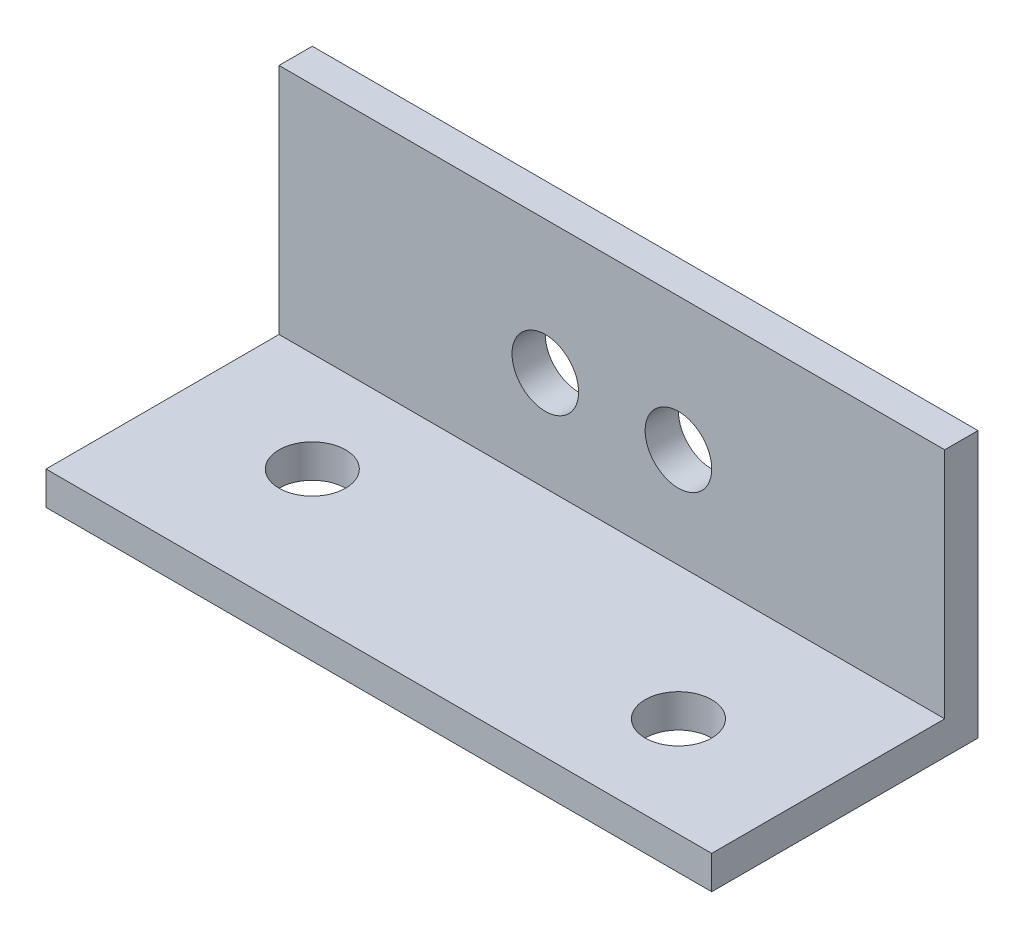
ISO-10303-21;
HEADER;
FILE_DESCRIPTION(('STEP AP214'),'2;1');
FILE_NAME('part.step','',(''),(''),'','','');
FILE_SCHEMA(('AUTOMOTIVE_DESIGN { 1 0 10303 214 1 1 1 1 }'));
ENDSEC;
DATA;
#1=APPLICATION_CONTEXT('core data for automotive mechanical design processes');
#2=APPLICATION_PROTOCOL_DEFINITION('international standard','automotive_design',2000,#1);
#3=PRODUCT_CONTEXT('',#1,'mechanical');
#4=PRODUCT('Part','Part','',(#3));
#5=PRODUCT_RELATED_PRODUCT_CATEGORY('part','',(#4));
#6=PRODUCT_DEFINITION_FORMATION('','',#4);
#7=PRODUCT_DEFINITION_CONTEXT('part definition',#1,'design');
#8=PRODUCT_DEFINITION('design','',#6,#7);
#9=PRODUCT_DEFINITION_SHAPE('','',#8);
#10=(LENGTH_UNIT() NAMED_UNIT(*) SI_UNIT(.MILLI.,.METRE.));
#11=(NAMED_UNIT(*) PLANE_ANGLE_UNIT() SI_UNIT($,.RADIAN.));
#12=(NAMED_UNIT(*) SI_UNIT($,.STERADIAN.) SOLID_ANGLE_UNIT());
#13=UNCERTAINTY_MEASURE_WITH_UNIT(LENGTH_MEASURE(1.E-05),#10,'distance_accuracy_value','');
#14=(GEOMETRIC_REPRESENTATION_CONTEXT(3) GLOBAL_UNCERTAINTY_ASSIGNED_CONTEXT((#13)) GLOBAL_UNIT_ASSIGNED_CONTEXT((#10,
#11,#12)) REPRESENTATION_CONTEXT('',''));
#15=CARTESIAN_POINT('',(0.,0.,0.));
#16=DIRECTION('',(0.,0.,1.));
#17=DIRECTION('',(1.,0.,0.));
#18=AXIS2_PLACEMENT_3D('',#15,#16,#17);
#19=CARTESIAN_POINT('',(0.,3.175,0.));
#20=DIRECTION('',(0.,-1.,0.));
#21=DIRECTION('',(0.,0.,-1.));
#22=AXIS2_PLACEMENT_3D('',#19,#20,#21);
#23=PLANE('',#22);
#24=CARTESIAN_POINT('',(19.05,3.175,3.175));
#25=DIRECTION('',(0.,1.,0.));
#26=DIRECTION('',(0.,0.,1.));
#27=AXIS2_PLACEMENT_3D('',#24,#25,#26);
#28=CIRCLE('',#27,3.175);
#29=CARTESIAN_POINT('',(19.05,3.175,6.35));
#30=VERTEX_POINT('',#29);
#31=EDGE_CURVE('E168',#30,#30,#28,.T.);
#32=ORIENTED_EDGE('',*,*,#31,.F.);
#33=EDGE_LOOP('',(#32));
#34=FACE_BOUND('',#33,.T.);
#35=CARTESIAN_POINT('',(-19.05,3.175,0.));
#36=DIRECTION('',(0.,1.,0.));
#37=DIRECTION('',(0.,0.,1.));
#38=AXIS2_PLACEMENT_3D('',#35,#36,#37);
#39=CIRCLE('',#38,3.175);
#40=CARTESIAN_POINT('',(-19.05,3.175,3.175));
#41=VERTEX_POINT('',#40);
#42=EDGE_CURVE('E162',#41,#41,#39,.T.);
#43=ORIENTED_EDGE('',*,*,#42,.F.);
#44=EDGE_LOOP('',(#43));
#45=FACE_BOUND('',#44,.T.);
#46=DIRECTION('',(1.,0.,0.));
#47=VECTOR('',#46,1.);
#48=CARTESIAN_POINT('',(-31.75,3.175,-9.525));
#49=LINE('',#48,#47);
#50=CARTESIAN_POINT('',(-31.75,3.175,-9.525));
#51=VERTEX_POINT('',#50);
#52=CARTESIAN_POINT('',(31.75,3.175,-9.525));
#53=VERTEX_POINT('',#52);
#54=EDGE_CURVE('E54',#51,#53,#49,.T.);
#55=ORIENTED_EDGE('',*,*,#54,.F.);
#56=DIRECTION('',(0.,0.,1.));
#57=VECTOR('',#56,1.);
#58=CARTESIAN_POINT('',(-31.75,3.175,12.7));
#59=LINE('',#58,#57);
#60=CARTESIAN_POINT('',(-31.75,3.175,12.7));
#61=VERTEX_POINT('',#60);
#62=EDGE_CURVE('E140',#51,#61,#59,.T.);
#63=ORIENTED_EDGE('',*,*,#62,.T.);
#64=DIRECTION('',(1.,0.,0.));
#65=VECTOR('',#64,1.);
#66=CARTESIAN_POINT('',(-31.75,3.175,12.7));
#67=LINE('',#66,#65);
#68=CARTESIAN_POINT('',(31.75,3.175,12.7));
#69=VERTEX_POINT('',#68);
#70=EDGE_CURVE('E60',#61,#69,#67,.T.);
#71=ORIENTED_EDGE('',*,*,#70,.T.);
#72=DIRECTION('',(0.,0.,-1.));
#73=VECTOR('',#72,1.);
#74=CARTESIAN_POINT('',(31.75,3.175,12.7));
#75=LINE('',#74,#73);
#76=EDGE_CURVE('E89',#69,#53,#75,.T.);
#77=ORIENTED_EDGE('',*,*,#76,.T.);
#78=EDGE_LOOP('',(#55,#63,#71,#77));
#79=FACE_BOUND('',#78,.T.);
#80=ADVANCED_FACE('F39',(#34,#45,#79),#23,.F.);
#81=CARTESIAN_POINT('',(31.75,3.175,12.7));
#82=DIRECTION('',(-1.,0.,0.));
#83=DIRECTION('',(0.,0.,1.));
#84=AXIS2_PLACEMENT_3D('',#81,#82,#83);
#85=PLANE('',#84);
#86=DIRECTION('',(0.,0.,-1.));
#87=VECTOR('',#86,1.);
#88=CARTESIAN_POINT('',(31.75,0.,12.7));
#89=LINE('',#88,#87);
#90=CARTESIAN_POINT('',(31.75,0.,12.7));
#91=VERTEX_POINT('',#90);
#92=CARTESIAN_POINT('',(31.75,0.,-12.7));
#93=VERTEX_POINT('',#92);
#94=EDGE_CURVE('E95',#91,#93,#89,.T.);
#95=ORIENTED_EDGE('',*,*,#94,.T.);
#96=DIRECTION('',(0.,-1.,0.));
#97=VECTOR('',#96,1.);
#98=CARTESIAN_POINT('',(31.75,3.175,-12.7));
#99=LINE('',#98,#97);
#100=CARTESIAN_POINT('',(31.75,25.4,-12.7));
#101=VERTEX_POINT('',#100);
#102=EDGE_CURVE('E11',#101,#93,#99,.T.);
#103=ORIENTED_EDGE('',*,*,#102,.F.);
#104=DIRECTION('',(0.,0.,-1.));
#105=VECTOR('',#104,1.);
#106=CARTESIAN_POINT('',(31.75,25.4,-12.7));
#107=LINE('',#106,#105);
#108=CARTESIAN_POINT('',(31.75,25.4,-9.525));
#109=VERTEX_POINT('',#108);
#110=EDGE_CURVE('E131',#109,#101,#107,.T.);
#111=ORIENTED_EDGE('',*,*,#110,.F.);
#112=DIRECTION('',(0.,-1.,0.));
#113=VECTOR('',#112,1.);
#114=CARTESIAN_POINT('',(31.75,25.4,-9.525));
#115=LINE('',#114,#113);
#116=EDGE_CURVE('E104',#109,#53,#115,.T.);
#117=ORIENTED_EDGE('',*,*,#116,.T.);
#118=ORIENTED_EDGE('',*,*,#76,.F.);
#119=DIRECTION('',(0.,-1.,0.));
#120=VECTOR('',#119,1.);
#121=CARTESIAN_POINT('',(31.75,3.175,12.7));
#122=LINE('',#121,#120);
#123=EDGE_CURVE('E82',#69,#91,#122,.T.);
#124=ORIENTED_EDGE('',*,*,#123,.T.);
#125=EDGE_LOOP('',(#95,#103,#111,#117,#118,#124));
#126=FACE_BOUND('',#125,.T.);
#127=ADVANCED_FACE('F41',(#126),#85,.F.);
#128=CARTESIAN_POINT('',(-31.75,3.175,-12.7));
#129=DIRECTION('',(0.,0.,1.));
#130=DIRECTION('',(1.,0.,0.));
#131=AXIS2_PLACEMENT_3D('',#128,#129,#130);
#132=PLANE('',#131);
#133=CARTESIAN_POINT('',(6.34999999999999,12.7,-12.7));
#134=DIRECTION('',(0.,0.,1.));
#135=DIRECTION('',(1.,0.,0.));
#136=AXIS2_PLACEMENT_3D('',#133,#134,#135);
#137=CIRCLE('',#136,3.175);
#138=CARTESIAN_POINT('',(9.525,12.7,-12.7));
#139=VERTEX_POINT('',#138);
#140=EDGE_CURVE('E153',#139,#139,#137,.T.);
#141=ORIENTED_EDGE('',*,*,#140,.T.);
#142=EDGE_LOOP('',(#141));
#143=FACE_BOUND('',#142,.T.);
#144=CARTESIAN_POINT('',(-6.35000000000001,12.7,-12.7));
#145=DIRECTION('',(0.,0.,1.));
#146=DIRECTION('',(1.,0.,0.));
#147=AXIS2_PLACEMENT_3D('',#144,#145,#146);
#148=CIRCLE('',#147,3.175);
#149=CARTESIAN_POINT('',(-3.17500000000001,12.7,-12.7));
#150=VERTEX_POINT('',#149);
#151=EDGE_CURVE('E138',#150,#150,#148,.T.);
#152=ORIENTED_EDGE('',*,*,#151,.T.);
#153=EDGE_LOOP('',(#152));
#154=FACE_BOUND('',#153,.T.);
#155=DIRECTION('',(-1.,0.,0.));
#156=VECTOR('',#155,1.);
#157=CARTESIAN_POINT('',(-31.75,0.,-12.7));
#158=LINE('',#157,#156);
#159=CARTESIAN_POINT('',(-31.75,0.,-12.7));
#160=VERTEX_POINT('',#159);
#161=EDGE_CURVE('E99',#93,#160,#158,.T.);
#162=ORIENTED_EDGE('',*,*,#161,.T.);
#163=DIRECTION('',(0.,-1.,0.));
#164=VECTOR('',#163,1.);
#165=CARTESIAN_POINT('',(-31.75,3.175,-12.7));
#166=LINE('',#165,#164);
#167=CARTESIAN_POINT('',(-31.75,25.4,-12.7));
#168=VERTEX_POINT('',#167);
#169=EDGE_CURVE('E47',#168,#160,#166,.T.);
#170=ORIENTED_EDGE('',*,*,#169,.F.);
#171=DIRECTION('',(-1.,0.,0.));
#172=VECTOR('',#171,1.);
#173=CARTESIAN_POINT('',(-31.75,25.4,-12.7));
#174=LINE('',#173,#172);
#175=EDGE_CURVE('E123',#101,#168,#174,.T.);
#176=ORIENTED_EDGE('',*,*,#175,.F.);
#177=ORIENTED_EDGE('',*,*,#102,.T.);
#178=EDGE_LOOP('',(#162,#170,#176,#177));
#179=FACE_BOUND('',#178,.T.);
#180=ADVANCED_FACE('F121',(#143,#154,#179),#132,.F.);
#181=CARTESIAN_POINT('',(-31.75,3.175,12.7));
#182=DIRECTION('',(1.,0.,0.));
#183=DIRECTION('',(0.,0.,-1.));
#184=AXIS2_PLACEMENT_3D('',#181,#182,#183);
#185=PLANE('',#184);
#186=DIRECTION('',(0.,0.,1.));
#187=VECTOR('',#186,1.);
#188=CARTESIAN_POINT('',(-31.75,0.,12.7));
#189=LINE('',#188,#187);
#190=CARTESIAN_POINT('',(-31.75,0.,12.7));
#191=VERTEX_POINT('',#190);
#192=EDGE_CURVE('E90',#160,#191,#189,.T.);
#193=ORIENTED_EDGE('',*,*,#192,.T.);
#194=DIRECTION('',(0.,-1.,0.));
#195=VECTOR('',#194,1.);
#196=CARTESIAN_POINT('',(-31.75,3.175,12.7));
#197=LINE('',#196,#195);
#198=EDGE_CURVE('E85',#61,#191,#197,.T.);
#199=ORIENTED_EDGE('',*,*,#198,.F.);
#200=ORIENTED_EDGE('',*,*,#62,.F.);
#201=DIRECTION('',(0.,-1.,0.));
#202=VECTOR('',#201,1.);
#203=CARTESIAN_POINT('',(-31.75,25.4,-9.525));
#204=LINE('',#203,#202);
#205=CARTESIAN_POINT('',(-31.75,25.4,-9.525));
#206=VERTEX_POINT('',#205);
#207=EDGE_CURVE('E100',#206,#51,#204,.T.);
#208=ORIENTED_EDGE('',*,*,#207,.F.);
#209=DIRECTION('',(0.,0.,1.));
#210=VECTOR('',#209,1.);
#211=CARTESIAN_POINT('',(-31.75,25.4,-12.7));
#212=LINE('',#211,#210);
#213=EDGE_CURVE('E117',#168,#206,#212,.T.);
#214=ORIENTED_EDGE('',*,*,#213,.F.);
#215=ORIENTED_EDGE('',*,*,#169,.T.);
#216=EDGE_LOOP('',(#193,#199,#200,#208,#214,#215));
#217=FACE_BOUND('',#216,.T.);
#218=ADVANCED_FACE('F114',(#217),#185,.F.);
#219=CARTESIAN_POINT('',(-31.75,3.175,12.7));
#220=DIRECTION('',(0.,0.,-1.));
#221=DIRECTION('',(-1.,0.,0.));
#222=AXIS2_PLACEMENT_3D('',#219,#220,#221);
#223=PLANE('',#222);
#224=DIRECTION('',(1.,0.,0.));
#225=VECTOR('',#224,1.);
#226=CARTESIAN_POINT('',(-31.75,0.,12.7));
#227=LINE('',#226,#225);
#228=EDGE_CURVE('E79',#191,#91,#227,.T.);
#229=ORIENTED_EDGE('',*,*,#228,.T.);
#230=ORIENTED_EDGE('',*,*,#123,.F.);
#231=ORIENTED_EDGE('',*,*,#70,.F.);
#232=ORIENTED_EDGE('',*,*,#198,.T.);
#233=EDGE_LOOP('',(#229,#230,#231,#232));
#234=FACE_BOUND('',#233,.T.);
#235=ADVANCED_FACE('F81',(#234),#223,.F.);
#236=CARTESIAN_POINT('',(0.,0.,0.));
#237=DIRECTION('',(0.,-1.,0.));
#238=DIRECTION('',(0.,0.,-1.));
#239=AXIS2_PLACEMENT_3D('',#236,#237,#238);
#240=PLANE('',#239);
#241=CARTESIAN_POINT('',(19.05,0.,3.175));
#242=DIRECTION('',(0.,1.,0.));
#243=DIRECTION('',(0.,0.,1.));
#244=AXIS2_PLACEMENT_3D('',#241,#242,#243);
#245=CIRCLE('',#244,3.175);
#246=CARTESIAN_POINT('',(19.05,0.,6.35));
#247=VERTEX_POINT('',#246);
#248=EDGE_CURVE('E165',#247,#247,#245,.T.);
#249=ORIENTED_EDGE('',*,*,#248,.T.);
#250=EDGE_LOOP('',(#249));
#251=FACE_BOUND('',#250,.T.);
#252=CARTESIAN_POINT('',(-19.05,0.,0.));
#253=DIRECTION('',(0.,1.,0.));
#254=DIRECTION('',(0.,0.,1.));
#255=AXIS2_PLACEMENT_3D('',#252,#253,#254);
#256=CIRCLE('',#255,3.175);
#257=CARTESIAN_POINT('',(-19.05,0.,3.175));
#258=VERTEX_POINT('',#257);
#259=EDGE_CURVE('E159',#258,#258,#256,.T.);
#260=ORIENTED_EDGE('',*,*,#259,.T.);
#261=EDGE_LOOP('',(#260));
#262=FACE_BOUND('',#261,.T.);
#263=ORIENTED_EDGE('',*,*,#94,.F.);
#264=ORIENTED_EDGE('',*,*,#228,.F.);
#265=ORIENTED_EDGE('',*,*,#192,.F.);
#266=ORIENTED_EDGE('',*,*,#161,.F.);
#267=EDGE_LOOP('',(#263,#264,#265,#266));
#268=FACE_BOUND('',#267,.T.);
#269=ADVANCED_FACE('F98',(#251,#262,#268),#240,.T.);
#270=CARTESIAN_POINT('',(-31.75,25.4,-9.525));
#271=DIRECTION('',(0.,0.,-1.));
#272=DIRECTION('',(-1.,0.,0.));
#273=AXIS2_PLACEMENT_3D('',#270,#271,#272);
#274=PLANE('',#273);
#275=CARTESIAN_POINT('',(6.34999999999999,12.7,-9.525));
#276=DIRECTION('',(0.,0.,1.));
#277=DIRECTION('',(1.,0.,0.));
#278=AXIS2_PLACEMENT_3D('',#275,#276,#277);
#279=CIRCLE('',#278,3.175);
#280=CARTESIAN_POINT('',(9.525,12.7,-9.525));
#281=VERTEX_POINT('',#280);
#282=EDGE_CURVE('E156',#281,#281,#279,.T.);
#283=ORIENTED_EDGE('',*,*,#282,.F.);
#284=EDGE_LOOP('',(#283));
#285=FACE_BOUND('',#284,.T.);
#286=CARTESIAN_POINT('',(-6.35000000000001,12.7,-9.525));
#287=DIRECTION('',(0.,0.,1.));
#288=DIRECTION('',(1.,0.,0.));
#289=AXIS2_PLACEMENT_3D('',#286,#287,#288);
#290=CIRCLE('',#289,3.175);
#291=CARTESIAN_POINT('',(-3.17500000000001,12.7,-9.525));
#292=VERTEX_POINT('',#291);
#293=EDGE_CURVE('E150',#292,#292,#290,.T.);
#294=ORIENTED_EDGE('',*,*,#293,.F.);
#295=EDGE_LOOP('',(#294));
#296=FACE_BOUND('',#295,.T.);
#297=ORIENTED_EDGE('',*,*,#54,.T.);
#298=ORIENTED_EDGE('',*,*,#116,.F.);
#299=DIRECTION('',(1.,0.,0.));
#300=VECTOR('',#299,1.);
#301=CARTESIAN_POINT('',(-31.75,25.4,-9.525));
#302=LINE('',#301,#300);
#303=EDGE_CURVE('E134',#206,#109,#302,.T.);
#304=ORIENTED_EDGE('',*,*,#303,.F.);
#305=ORIENTED_EDGE('',*,*,#207,.T.);
#306=EDGE_LOOP('',(#297,#298,#304,#305));
#307=FACE_BOUND('',#306,.T.);
#308=ADVANCED_FACE('F143',(#285,#296,#307),#274,.F.);
#309=CARTESIAN_POINT('',(0.,25.4,0.));
#310=DIRECTION('',(0.,1.,0.));
#311=DIRECTION('',(0.,0.,1.));
#312=AXIS2_PLACEMENT_3D('',#309,#310,#311);
#313=PLANE('',#312);
#314=ORIENTED_EDGE('',*,*,#213,.T.);
#315=ORIENTED_EDGE('',*,*,#303,.T.);
#316=ORIENTED_EDGE('',*,*,#110,.T.);
#317=ORIENTED_EDGE('',*,*,#175,.T.);
#318=EDGE_LOOP('',(#314,#315,#316,#317));
#319=FACE_BOUND('',#318,.T.);
#320=ADVANCED_FACE('F127',(#319),#313,.T.);
#321=CARTESIAN_POINT('',(-6.35000000000001,12.7,-12.7));
#322=DIRECTION('',(0.,0.,1.));
#323=DIRECTION('',(1.,0.,0.));
#324=AXIS2_PLACEMENT_3D('',#321,#322,#323);
#325=CYLINDRICAL_SURFACE('',#324,3.175);
#326=ORIENTED_EDGE('',*,*,#151,.F.);
#327=EDGE_LOOP('',(#326));
#328=FACE_BOUND('',#327,.T.);
#329=ORIENTED_EDGE('',*,*,#293,.T.);
#330=EDGE_LOOP('',(#329));
#331=FACE_BOUND('',#330,.T.);
#332=ADVANCED_FACE('F196',(#328,#331),#325,.F.);
#333=CARTESIAN_POINT('',(6.34999999999999,12.7,-12.7));
#334=DIRECTION('',(0.,0.,1.));
#335=DIRECTION('',(1.,0.,0.));
#336=AXIS2_PLACEMENT_3D('',#333,#334,#335);
#337=CYLINDRICAL_SURFACE('',#336,3.175);
#338=ORIENTED_EDGE('',*,*,#140,.F.);
#339=EDGE_LOOP('',(#338));
#340=FACE_BOUND('',#339,.T.);
#341=ORIENTED_EDGE('',*,*,#282,.T.);
#342=EDGE_LOOP('',(#341));
#343=FACE_BOUND('',#342,.T.);
#344=ADVANCED_FACE('F189',(#340,#343),#337,.F.);
#345=CARTESIAN_POINT('',(-19.05,0.,0.));
#346=DIRECTION('',(0.,1.,0.));
#347=DIRECTION('',(0.,0.,1.));
#348=AXIS2_PLACEMENT_3D('',#345,#346,#347);
#349=CYLINDRICAL_SURFACE('',#348,3.175);
#350=ORIENTED_EDGE('',*,*,#259,.F.);
#351=EDGE_LOOP('',(#350));
#352=FACE_BOUND('',#351,.T.);
#353=ORIENTED_EDGE('',*,*,#42,.T.);
#354=EDGE_LOOP('',(#353));
#355=FACE_BOUND('',#354,.T.);
#356=ADVANCED_FACE('F179',(#352,#355),#349,.F.);
#357=CARTESIAN_POINT('',(19.05,0.,3.175));
#358=DIRECTION('',(0.,1.,0.));
#359=DIRECTION('',(0.,0.,1.));
#360=AXIS2_PLACEMENT_3D('',#357,#358,#359);
#361=CYLINDRICAL_SURFACE('',#360,3.175);
#362=ORIENTED_EDGE('',*,*,#248,.F.);
#363=EDGE_LOOP('',(#362));
#364=FACE_BOUND('',#363,.T.);
#365=ORIENTED_EDGE('',*,*,#31,.T.);
#366=EDGE_LOOP('',(#365));
#367=FACE_BOUND('',#366,.T.);
#368=ADVANCED_FACE('F176',(#364,#367),#361,.F.);
#369=CLOSED_SHELL('',(#80,#127,#180,#218,#235,#269,#308,#320,#332,#344,#356,#368));
#370=MANIFOLD_SOLID_BREP('B2',#369);
#371=ADVANCED_BREP_SHAPE_REPRESENTATION('',(#18,#370),#14);
#372=SHAPE_DEFINITION_REPRESENTATION(#9,#371);
ENDSEC;
END-ISO-10303-21;
